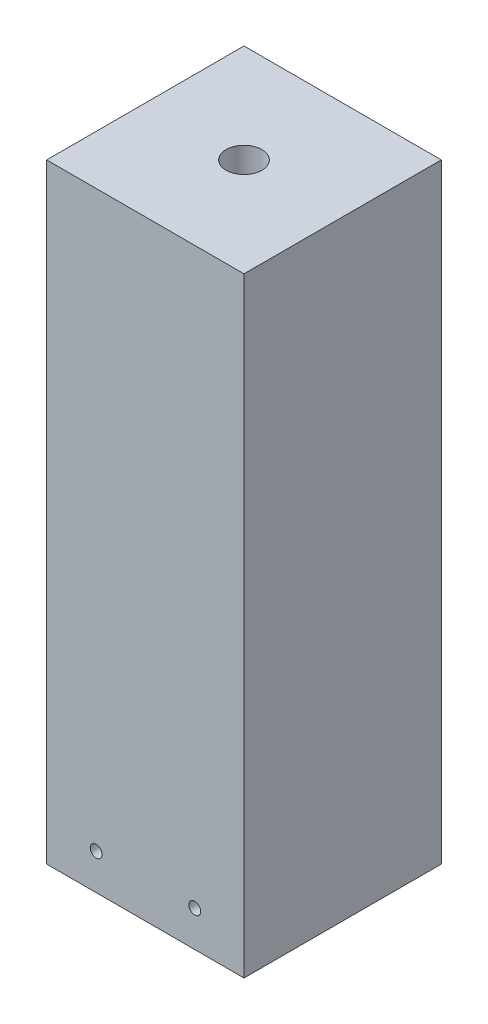
ISO-10303-21;
HEADER;
FILE_DESCRIPTION(('STEP AP214'),'2;1');
FILE_NAME('part.step','',(''),(''),'','','');
FILE_SCHEMA(('AUTOMOTIVE_DESIGN { 1 0 10303 214 1 1 1 1 }'));
ENDSEC;
DATA;
#1=APPLICATION_CONTEXT('core data for automotive mechanical design processes');
#2=APPLICATION_PROTOCOL_DEFINITION('international standard','automotive_design',2000,#1);
#3=PRODUCT_CONTEXT('',#1,'mechanical');
#4=PRODUCT('Part','Part','',(#3));
#5=PRODUCT_RELATED_PRODUCT_CATEGORY('part','',(#4));
#6=PRODUCT_DEFINITION_FORMATION('','',#4);
#7=PRODUCT_DEFINITION_CONTEXT('part definition',#1,'design');
#8=PRODUCT_DEFINITION('design','',#6,#7);
#9=PRODUCT_DEFINITION_SHAPE('','',#8);
#10=(LENGTH_UNIT() NAMED_UNIT(*) SI_UNIT(.MILLI.,.METRE.));
#11=(NAMED_UNIT(*) PLANE_ANGLE_UNIT() SI_UNIT($,.RADIAN.));
#12=(NAMED_UNIT(*) SI_UNIT($,.STERADIAN.) SOLID_ANGLE_UNIT());
#13=UNCERTAINTY_MEASURE_WITH_UNIT(LENGTH_MEASURE(1.E-05),#10,'distance_accuracy_value','');
#14=(GEOMETRIC_REPRESENTATION_CONTEXT(3) GLOBAL_UNCERTAINTY_ASSIGNED_CONTEXT((#13)) GLOBAL_UNIT_ASSIGNED_CONTEXT((#10,
#11,#12)) REPRESENTATION_CONTEXT('',''));
#15=CARTESIAN_POINT('',(0.,0.,0.));
#16=DIRECTION('',(0.,0.,1.));
#17=DIRECTION('',(1.,0.,0.));
#18=AXIS2_PLACEMENT_3D('',#15,#16,#17);
#19=CARTESIAN_POINT('',(0.,0.,0.));
#20=DIRECTION('',(0.,1.,0.));
#21=DIRECTION('',(0.,0.,1.));
#22=AXIS2_PLACEMENT_3D('',#19,#20,#21);
#23=PLANE('',#22);
#24=DIRECTION('',(0.,0.,-1.));
#25=VECTOR('',#24,1.);
#26=CARTESIAN_POINT('',(27.5,0.,-27.5));
#27=LINE('',#26,#25);
#28=CARTESIAN_POINT('',(27.5,0.,27.5));
#29=VERTEX_POINT('',#28);
#30=CARTESIAN_POINT('',(27.5,0.,-27.5));
#31=VERTEX_POINT('',#30);
#32=EDGE_CURVE('E219',#29,#31,#27,.T.);
#33=ORIENTED_EDGE('',*,*,#32,.F.);
#34=DIRECTION('',(1.,0.,0.));
#35=VECTOR('',#34,1.);
#36=CARTESIAN_POINT('',(-27.5,0.,27.5));
#37=LINE('',#36,#35);
#38=CARTESIAN_POINT('',(-27.5,0.,27.5));
#39=VERTEX_POINT('',#38);
#40=EDGE_CURVE('E225',#39,#29,#37,.T.);
#41=ORIENTED_EDGE('',*,*,#40,.F.);
#42=DIRECTION('',(0.,0.,1.));
#43=VECTOR('',#42,1.);
#44=CARTESIAN_POINT('',(-27.5,0.,-27.5));
#45=LINE('',#44,#43);
#46=CARTESIAN_POINT('',(-27.5,0.,-27.5));
#47=VERTEX_POINT('',#46);
#48=EDGE_CURVE('E241',#47,#39,#45,.T.);
#49=ORIENTED_EDGE('',*,*,#48,.F.);
#50=DIRECTION('',(-1.,0.,0.));
#51=VECTOR('',#50,1.);
#52=CARTESIAN_POINT('',(-27.5,0.,-27.5));
#53=LINE('',#52,#51);
#54=EDGE_CURVE('E238',#31,#47,#53,.T.);
#55=ORIENTED_EDGE('',*,*,#54,.F.);
#56=EDGE_LOOP('',(#33,#41,#49,#55));
#57=FACE_BOUND('',#56,.T.);
#58=DIRECTION('',(0.,0.,-1.));
#59=VECTOR('',#58,1.);
#60=CARTESIAN_POINT('',(23.,0.,-23.));
#61=LINE('',#60,#59);
#62=CARTESIAN_POINT('',(23.,0.,23.));
#63=VERTEX_POINT('',#62);
#64=CARTESIAN_POINT('',(23.,0.,-23.));
#65=VERTEX_POINT('',#64);
#66=EDGE_CURVE('E176',#63,#65,#61,.T.);
#67=ORIENTED_EDGE('',*,*,#66,.T.);
#68=DIRECTION('',(-1.,0.,0.));
#69=VECTOR('',#68,1.);
#70=CARTESIAN_POINT('',(-23.,0.,-23.));
#71=LINE('',#70,#69);
#72=CARTESIAN_POINT('',(-23.,0.,-23.));
#73=VERTEX_POINT('',#72);
#74=EDGE_CURVE('E195',#65,#73,#71,.T.);
#75=ORIENTED_EDGE('',*,*,#74,.T.);
#76=DIRECTION('',(0.,0.,1.));
#77=VECTOR('',#76,1.);
#78=CARTESIAN_POINT('',(-23.,0.,-23.));
#79=LINE('',#78,#77);
#80=CARTESIAN_POINT('',(-23.,0.,23.));
#81=VERTEX_POINT('',#80);
#82=EDGE_CURVE('E199',#73,#81,#79,.T.);
#83=ORIENTED_EDGE('',*,*,#82,.T.);
#84=DIRECTION('',(1.,0.,0.));
#85=VECTOR('',#84,1.);
#86=CARTESIAN_POINT('',(-23.,0.,23.));
#87=LINE('',#86,#85);
#88=EDGE_CURVE('E182',#81,#63,#87,.T.);
#89=ORIENTED_EDGE('',*,*,#88,.T.);
#90=EDGE_LOOP('',(#67,#75,#83,#89));
#91=FACE_BOUND('',#90,.T.);
#92=ADVANCED_FACE('F38',(#57,#91),#23,.F.);
#93=CARTESIAN_POINT('',(27.5,170.,-27.5));
#94=DIRECTION('',(-1.,0.,0.));
#95=DIRECTION('',(0.,0.,1.));
#96=AXIS2_PLACEMENT_3D('',#93,#94,#95);
#97=PLANE('',#96);
#98=ORIENTED_EDGE('',*,*,#32,.T.);
#99=DIRECTION('',(0.,-1.,0.));
#100=VECTOR('',#99,1.);
#101=CARTESIAN_POINT('',(27.5,170.,-27.5));
#102=LINE('',#101,#100);
#103=CARTESIAN_POINT('',(27.5,170.,-27.5));
#104=VERTEX_POINT('',#103);
#105=EDGE_CURVE('E11',#104,#31,#102,.T.);
#106=ORIENTED_EDGE('',*,*,#105,.F.);
#107=DIRECTION('',(0.,0.,-1.));
#108=VECTOR('',#107,1.);
#109=CARTESIAN_POINT('',(27.5,170.,-27.5));
#110=LINE('',#109,#108);
#111=CARTESIAN_POINT('',(27.5,170.,27.5));
#112=VERTEX_POINT('',#111);
#113=EDGE_CURVE('E220',#112,#104,#110,.T.);
#114=ORIENTED_EDGE('',*,*,#113,.F.);
#115=DIRECTION('',(0.,-1.,0.));
#116=VECTOR('',#115,1.);
#117=CARTESIAN_POINT('',(27.5,170.,27.5));
#118=LINE('',#117,#116);
#119=EDGE_CURVE('E234',#112,#29,#118,.T.);
#120=ORIENTED_EDGE('',*,*,#119,.T.);
#121=EDGE_LOOP('',(#98,#106,#114,#120));
#122=FACE_BOUND('',#121,.T.);
#123=ADVANCED_FACE('F40',(#122),#97,.F.);
#124=CARTESIAN_POINT('',(-27.5,170.,-27.5));
#125=DIRECTION('',(0.,0.,1.));
#126=DIRECTION('',(1.,0.,0.));
#127=AXIS2_PLACEMENT_3D('',#124,#125,#126);
#128=PLANE('',#127);
#129=CARTESIAN_POINT('',(13.784,10.000000066,-27.5));
#130=DIRECTION('',(0.,0.,-1.));
#131=DIRECTION('',(-1.,0.,0.));
#132=AXIS2_PLACEMENT_3D('',#129,#130,#131);
#133=CIRCLE('',#132,1.675);
#134=CARTESIAN_POINT('',(12.109,10.000000066,-27.5));
#135=VERTEX_POINT('',#134);
#136=EDGE_CURVE('E280',#135,#135,#133,.T.);
#137=ORIENTED_EDGE('',*,*,#136,.F.);
#138=EDGE_LOOP('',(#137));
#139=FACE_BOUND('',#138,.T.);
#140=CARTESIAN_POINT('',(-13.716,10.000000066,-27.5));
#141=DIRECTION('',(0.,0.,-1.));
#142=DIRECTION('',(-1.,0.,0.));
#143=AXIS2_PLACEMENT_3D('',#140,#141,#142);
#144=CIRCLE('',#143,1.675);
#145=CARTESIAN_POINT('',(-15.391,10.000000066,-27.5));
#146=VERTEX_POINT('',#145);
#147=EDGE_CURVE('E271',#146,#146,#144,.T.);
#148=ORIENTED_EDGE('',*,*,#147,.F.);
#149=EDGE_LOOP('',(#148));
#150=FACE_BOUND('',#149,.T.);
#151=ORIENTED_EDGE('',*,*,#54,.T.);
#152=DIRECTION('',(0.,-1.,0.));
#153=VECTOR('',#152,1.);
#154=CARTESIAN_POINT('',(-27.5,170.,-27.5));
#155=LINE('',#154,#153);
#156=CARTESIAN_POINT('',(-27.5,170.,-27.5));
#157=VERTEX_POINT('',#156);
#158=EDGE_CURVE('E48',#157,#47,#155,.T.);
#159=ORIENTED_EDGE('',*,*,#158,.F.);
#160=DIRECTION('',(-1.,0.,0.));
#161=VECTOR('',#160,1.);
#162=CARTESIAN_POINT('',(-27.5,170.,-27.5));
#163=LINE('',#162,#161);
#164=EDGE_CURVE('E224',#104,#157,#163,.T.);
#165=ORIENTED_EDGE('',*,*,#164,.F.);
#166=ORIENTED_EDGE('',*,*,#105,.T.);
#167=EDGE_LOOP('',(#151,#159,#165,#166));
#168=FACE_BOUND('',#167,.T.);
#169=ADVANCED_FACE('F307',(#139,#150,#168),#128,.F.);
#170=CARTESIAN_POINT('',(-27.5,170.,-27.5));
#171=DIRECTION('',(1.,0.,0.));
#172=DIRECTION('',(0.,0.,-1.));
#173=AXIS2_PLACEMENT_3D('',#170,#171,#172);
#174=PLANE('',#173);
#175=DIRECTION('',(0.,0.,1.));
#176=VECTOR('',#175,1.);
#177=CARTESIAN_POINT('',(-27.5,143.175390269917,7.50000000000001));
#178=LINE('',#177,#176);
#179=CARTESIAN_POINT('',(-27.5,143.175390269917,-7.499999972));
#180=VERTEX_POINT('',#179);
#181=CARTESIAN_POINT('',(-27.5,143.175390269917,7.50000000000001));
#182=VERTEX_POINT('',#181);
#183=EDGE_CURVE('E158',#180,#182,#178,.T.);
#184=ORIENTED_EDGE('',*,*,#183,.F.);
#185=DIRECTION('',(0.,-1.,0.));
#186=VECTOR('',#185,1.);
#187=CARTESIAN_POINT('',(-27.5,148.175390269917,-7.499999972));
#188=LINE('',#187,#186);
#189=CARTESIAN_POINT('',(-27.5,148.175390269917,-7.499999972));
#190=VERTEX_POINT('',#189);
#191=EDGE_CURVE('E148',#190,#180,#188,.T.);
#192=ORIENTED_EDGE('',*,*,#191,.F.);
#193=DIRECTION('',(0.,0.,-1.));
#194=VECTOR('',#193,1.);
#195=CARTESIAN_POINT('',(-27.5,148.175390269917,-7.499999972));
#196=LINE('',#195,#194);
#197=CARTESIAN_POINT('',(-27.5,148.175390269917,7.5));
#198=VERTEX_POINT('',#197);
#199=EDGE_CURVE('E162',#198,#190,#196,.T.);
#200=ORIENTED_EDGE('',*,*,#199,.F.);
#201=DIRECTION('',(0.,1.,0.));
#202=VECTOR('',#201,1.);
#203=CARTESIAN_POINT('',(-27.5,148.175390269917,7.5));
#204=LINE('',#203,#202);
#205=EDGE_CURVE('E56',#182,#198,#204,.T.);
#206=ORIENTED_EDGE('',*,*,#205,.F.);
#207=EDGE_LOOP('',(#184,#192,#200,#206));
#208=FACE_BOUND('',#207,.T.);
#209=ORIENTED_EDGE('',*,*,#48,.T.);
#210=DIRECTION('',(0.,-1.,0.));
#211=VECTOR('',#210,1.);
#212=CARTESIAN_POINT('',(-27.5,170.,27.5));
#213=LINE('',#212,#211);
#214=CARTESIAN_POINT('',(-27.5,170.,27.5));
#215=VERTEX_POINT('',#214);
#216=EDGE_CURVE('E249',#215,#39,#213,.T.);
#217=ORIENTED_EDGE('',*,*,#216,.F.);
#218=DIRECTION('',(0.,0.,1.));
#219=VECTOR('',#218,1.);
#220=CARTESIAN_POINT('',(-27.5,170.,-27.5));
#221=LINE('',#220,#219);
#222=EDGE_CURVE('E228',#157,#215,#221,.T.);
#223=ORIENTED_EDGE('',*,*,#222,.F.);
#224=ORIENTED_EDGE('',*,*,#158,.T.);
#225=EDGE_LOOP('',(#209,#217,#223,#224));
#226=FACE_BOUND('',#225,.T.);
#227=ADVANCED_FACE('F303',(#208,#226),#174,.F.);
#228=CARTESIAN_POINT('',(-27.5,170.,27.5));
#229=DIRECTION('',(0.,0.,-1.));
#230=DIRECTION('',(-1.,0.,0.));
#231=AXIS2_PLACEMENT_3D('',#228,#229,#230);
#232=PLANE('',#231);
#233=CARTESIAN_POINT('',(13.784,10.000000066,27.5));
#234=DIRECTION('',(0.,0.,-1.));
#235=DIRECTION('',(-1.,0.,0.));
#236=AXIS2_PLACEMENT_3D('',#233,#234,#235);
#237=CIRCLE('',#236,1.64999999999999);
#238=CARTESIAN_POINT('',(12.134,10.000000066,27.5));
#239=VERTEX_POINT('',#238);
#240=EDGE_CURVE('E265',#239,#239,#237,.T.);
#241=ORIENTED_EDGE('',*,*,#240,.T.);
#242=EDGE_LOOP('',(#241));
#243=FACE_BOUND('',#242,.T.);
#244=CARTESIAN_POINT('',(-13.716,10.000000066,27.5));
#245=DIRECTION('',(0.,0.,-1.));
#246=DIRECTION('',(-1.,0.,0.));
#247=AXIS2_PLACEMENT_3D('',#244,#245,#246);
#248=CIRCLE('',#247,1.64999999999999);
#249=CARTESIAN_POINT('',(-15.366,10.000000066,27.5));
#250=VERTEX_POINT('',#249);
#251=EDGE_CURVE('E260',#250,#250,#248,.T.);
#252=ORIENTED_EDGE('',*,*,#251,.T.);
#253=EDGE_LOOP('',(#252));
#254=FACE_BOUND('',#253,.T.);
#255=ORIENTED_EDGE('',*,*,#40,.T.);
#256=ORIENTED_EDGE('',*,*,#119,.F.);
#257=DIRECTION('',(1.,0.,0.));
#258=VECTOR('',#257,1.);
#259=CARTESIAN_POINT('',(-27.5,170.,27.5));
#260=LINE('',#259,#258);
#261=EDGE_CURVE('E231',#215,#112,#260,.T.);
#262=ORIENTED_EDGE('',*,*,#261,.F.);
#263=ORIENTED_EDGE('',*,*,#216,.T.);
#264=EDGE_LOOP('',(#255,#256,#262,#263));
#265=FACE_BOUND('',#264,.T.);
#266=ADVANCED_FACE('F306',(#243,#254,#265),#232,.F.);
#267=CARTESIAN_POINT('',(0.,170.,0.));
#268=DIRECTION('',(0.,1.,0.));
#269=DIRECTION('',(0.,0.,1.));
#270=AXIS2_PLACEMENT_3D('',#267,#268,#269);
#271=PLANE('',#270);
#272=CARTESIAN_POINT('',(0.,170.,0.));
#273=DIRECTION('',(0.,1.,0.));
#274=DIRECTION('',(0.,0.,1.));
#275=AXIS2_PLACEMENT_3D('',#272,#273,#274);
#276=CIRCLE('',#275,5.);
#277=CARTESIAN_POINT('',(0.,170.,5.));
#278=VERTEX_POINT('',#277);
#279=EDGE_CURVE('E494',#278,#278,#276,.T.);
#280=ORIENTED_EDGE('',*,*,#279,.F.);
#281=EDGE_LOOP('',(#280));
#282=FACE_BOUND('',#281,.T.);
#283=ORIENTED_EDGE('',*,*,#113,.T.);
#284=ORIENTED_EDGE('',*,*,#164,.T.);
#285=ORIENTED_EDGE('',*,*,#222,.T.);
#286=ORIENTED_EDGE('',*,*,#261,.T.);
#287=EDGE_LOOP('',(#283,#284,#285,#286));
#288=FACE_BOUND('',#287,.T.);
#289=ADVANCED_FACE('F324',(#282,#288),#271,.T.);
#290=CARTESIAN_POINT('',(23.,160.,-23.));
#291=DIRECTION('',(-1.,0.,0.));
#292=DIRECTION('',(0.,0.,1.));
#293=AXIS2_PLACEMENT_3D('',#290,#291,#292);
#294=PLANE('',#293);
#295=ORIENTED_EDGE('',*,*,#66,.F.);
#296=DIRECTION('',(0.,-1.,0.));
#297=VECTOR('',#296,1.);
#298=CARTESIAN_POINT('',(23.,160.,23.));
#299=LINE('',#298,#297);
#300=CARTESIAN_POINT('',(23.,160.,23.));
#301=VERTEX_POINT('',#300);
#302=EDGE_CURVE('E191',#301,#63,#299,.T.);
#303=ORIENTED_EDGE('',*,*,#302,.F.);
#304=DIRECTION('',(0.,0.,-1.));
#305=VECTOR('',#304,1.);
#306=CARTESIAN_POINT('',(23.,160.,-23.));
#307=LINE('',#306,#305);
#308=CARTESIAN_POINT('',(23.,160.,-23.));
#309=VERTEX_POINT('',#308);
#310=EDGE_CURVE('E177',#301,#309,#307,.T.);
#311=ORIENTED_EDGE('',*,*,#310,.T.);
#312=DIRECTION('',(0.,-1.,0.));
#313=VECTOR('',#312,1.);
#314=CARTESIAN_POINT('',(23.,160.,-23.));
#315=LINE('',#314,#313);
#316=EDGE_CURVE('E215',#309,#65,#315,.T.);
#317=ORIENTED_EDGE('',*,*,#316,.T.);
#318=EDGE_LOOP('',(#295,#303,#311,#317));
#319=FACE_BOUND('',#318,.T.);
#320=ADVANCED_FACE('F344',(#319),#294,.T.);
#321=CARTESIAN_POINT('',(-23.,160.,-23.));
#322=DIRECTION('',(0.,0.,1.));
#323=DIRECTION('',(1.,0.,0.));
#324=AXIS2_PLACEMENT_3D('',#321,#322,#323);
#325=PLANE('',#324);
#326=CARTESIAN_POINT('',(13.784,10.000000066,-23.));
#327=DIRECTION('',(0.,0.,1.));
#328=DIRECTION('',(1.,0.,0.));
#329=AXIS2_PLACEMENT_3D('',#326,#327,#328);
#330=CIRCLE('',#329,1.64999999999999);
#331=CARTESIAN_POINT('',(15.434,10.000000066,-23.));
#332=VERTEX_POINT('',#331);
#333=EDGE_CURVE('E264',#332,#332,#330,.T.);
#334=ORIENTED_EDGE('',*,*,#333,.F.);
#335=EDGE_LOOP('',(#334));
#336=FACE_BOUND('',#335,.T.);
#337=CARTESIAN_POINT('',(-13.716,10.000000066,-23.));
#338=DIRECTION('',(0.,0.,1.));
#339=DIRECTION('',(1.,0.,0.));
#340=AXIS2_PLACEMENT_3D('',#337,#338,#339);
#341=CIRCLE('',#340,1.64999999999999);
#342=CARTESIAN_POINT('',(-12.066,10.000000066,-23.));
#343=VERTEX_POINT('',#342);
#344=EDGE_CURVE('E256',#343,#343,#341,.T.);
#345=ORIENTED_EDGE('',*,*,#344,.F.);
#346=EDGE_LOOP('',(#345));
#347=FACE_BOUND('',#346,.T.);
#348=ORIENTED_EDGE('',*,*,#74,.F.);
#349=ORIENTED_EDGE('',*,*,#316,.F.);
#350=DIRECTION('',(-1.,0.,0.));
#351=VECTOR('',#350,1.);
#352=CARTESIAN_POINT('',(-23.,160.,-23.));
#353=LINE('',#352,#351);
#354=CARTESIAN_POINT('',(-23.,160.,-23.));
#355=VERTEX_POINT('',#354);
#356=EDGE_CURVE('E181',#309,#355,#353,.T.);
#357=ORIENTED_EDGE('',*,*,#356,.T.);
#358=DIRECTION('',(0.,-1.,0.));
#359=VECTOR('',#358,1.);
#360=CARTESIAN_POINT('',(-23.,160.,-23.));
#361=LINE('',#360,#359);
#362=EDGE_CURVE('E212',#355,#73,#361,.T.);
#363=ORIENTED_EDGE('',*,*,#362,.T.);
#364=EDGE_LOOP('',(#348,#349,#357,#363));
#365=FACE_BOUND('',#364,.T.);
#366=ADVANCED_FACE('F377',(#336,#347,#365),#325,.T.);
#367=CARTESIAN_POINT('',(-23.,160.,-23.));
#368=DIRECTION('',(1.,0.,0.));
#369=DIRECTION('',(0.,0.,-1.));
#370=AXIS2_PLACEMENT_3D('',#367,#368,#369);
#371=PLANE('',#370);
#372=DIRECTION('',(0.,-1.,0.));
#373=VECTOR('',#372,1.);
#374=CARTESIAN_POINT('',(-23.,148.175390269917,-7.499999972));
#375=LINE('',#374,#373);
#376=CARTESIAN_POINT('',(-23.,148.175390269917,-7.499999972));
#377=VERTEX_POINT('',#376);
#378=CARTESIAN_POINT('',(-23.,143.175390269917,-7.499999972));
#379=VERTEX_POINT('',#378);
#380=EDGE_CURVE('E145',#377,#379,#375,.T.);
#381=ORIENTED_EDGE('',*,*,#380,.T.);
#382=DIRECTION('',(0.,0.,1.));
#383=VECTOR('',#382,1.);
#384=CARTESIAN_POINT('',(-23.,143.175390269917,7.50000000000001));
#385=LINE('',#384,#383);
#386=CARTESIAN_POINT('',(-23.,143.175390269917,7.50000000000001));
#387=VERTEX_POINT('',#386);
#388=EDGE_CURVE('E131',#379,#387,#385,.T.);
#389=ORIENTED_EDGE('',*,*,#388,.T.);
#390=DIRECTION('',(0.,1.,0.));
#391=VECTOR('',#390,1.);
#392=CARTESIAN_POINT('',(-23.,148.175390269917,7.5));
#393=LINE('',#392,#391);
#394=CARTESIAN_POINT('',(-23.,148.175390269917,7.5));
#395=VERTEX_POINT('',#394);
#396=EDGE_CURVE('E167',#387,#395,#393,.T.);
#397=ORIENTED_EDGE('',*,*,#396,.T.);
#398=DIRECTION('',(0.,0.,-1.));
#399=VECTOR('',#398,1.);
#400=CARTESIAN_POINT('',(-23.,148.175390269917,-7.499999972));
#401=LINE('',#400,#399);
#402=EDGE_CURVE('E154',#395,#377,#401,.T.);
#403=ORIENTED_EDGE('',*,*,#402,.T.);
#404=EDGE_LOOP('',(#381,#389,#397,#403));
#405=FACE_BOUND('',#404,.T.);
#406=ORIENTED_EDGE('',*,*,#82,.F.);
#407=ORIENTED_EDGE('',*,*,#362,.F.);
#408=DIRECTION('',(0.,0.,1.));
#409=VECTOR('',#408,1.);
#410=CARTESIAN_POINT('',(-23.,160.,-23.));
#411=LINE('',#410,#409);
#412=CARTESIAN_POINT('',(-23.,160.,23.));
#413=VERTEX_POINT('',#412);
#414=EDGE_CURVE('E185',#355,#413,#411,.T.);
#415=ORIENTED_EDGE('',*,*,#414,.T.);
#416=DIRECTION('',(0.,-1.,0.));
#417=VECTOR('',#416,1.);
#418=CARTESIAN_POINT('',(-23.,160.,23.));
#419=LINE('',#418,#417);
#420=EDGE_CURVE('E209',#413,#81,#419,.T.);
#421=ORIENTED_EDGE('',*,*,#420,.T.);
#422=EDGE_LOOP('',(#406,#407,#415,#421));
#423=FACE_BOUND('',#422,.T.);
#424=ADVANCED_FACE('F152',(#405,#423),#371,.T.);
#425=CARTESIAN_POINT('',(-23.,160.,23.));
#426=DIRECTION('',(0.,0.,-1.));
#427=DIRECTION('',(-1.,0.,0.));
#428=AXIS2_PLACEMENT_3D('',#425,#426,#427);
#429=PLANE('',#428);
#430=CARTESIAN_POINT('',(13.784,10.000000066,23.));
#431=DIRECTION('',(0.,0.,-1.));
#432=DIRECTION('',(-1.,0.,0.));
#433=AXIS2_PLACEMENT_3D('',#430,#431,#432);
#434=CIRCLE('',#433,1.64999999999999);
#435=CARTESIAN_POINT('',(12.134,10.000000066,23.));
#436=VERTEX_POINT('',#435);
#437=EDGE_CURVE('E261',#436,#436,#434,.T.);
#438=ORIENTED_EDGE('',*,*,#437,.F.);
#439=EDGE_LOOP('',(#438));
#440=FACE_BOUND('',#439,.T.);
#441=CARTESIAN_POINT('',(-13.716,10.000000066,23.));
#442=DIRECTION('',(0.,0.,-1.));
#443=DIRECTION('',(-1.,0.,0.));
#444=AXIS2_PLACEMENT_3D('',#441,#442,#443);
#445=CIRCLE('',#444,1.64999999999999);
#446=CARTESIAN_POINT('',(-15.366,10.000000066,23.));
#447=VERTEX_POINT('',#446);
#448=EDGE_CURVE('E259',#447,#447,#445,.T.);
#449=ORIENTED_EDGE('',*,*,#448,.F.);
#450=EDGE_LOOP('',(#449));
#451=FACE_BOUND('',#450,.T.);
#452=ORIENTED_EDGE('',*,*,#88,.F.);
#453=ORIENTED_EDGE('',*,*,#420,.F.);
#454=DIRECTION('',(1.,0.,0.));
#455=VECTOR('',#454,1.);
#456=CARTESIAN_POINT('',(-23.,160.,23.));
#457=LINE('',#456,#455);
#458=EDGE_CURVE('E188',#413,#301,#457,.T.);
#459=ORIENTED_EDGE('',*,*,#458,.T.);
#460=ORIENTED_EDGE('',*,*,#302,.T.);
#461=EDGE_LOOP('',(#452,#453,#459,#460));
#462=FACE_BOUND('',#461,.T.);
#463=ADVANCED_FACE('F391',(#440,#451,#462),#429,.T.);
#464=CARTESIAN_POINT('',(0.,160.,0.));
#465=DIRECTION('',(0.,1.,0.));
#466=DIRECTION('',(0.,0.,1.));
#467=AXIS2_PLACEMENT_3D('',#464,#465,#466);
#468=PLANE('',#467);
#469=CARTESIAN_POINT('',(0.,160.,0.));
#470=DIRECTION('',(0.,1.,0.));
#471=DIRECTION('',(0.,0.,1.));
#472=AXIS2_PLACEMENT_3D('',#469,#470,#471);
#473=CIRCLE('',#472,5.);
#474=CARTESIAN_POINT('',(0.,160.,5.));
#475=VERTEX_POINT('',#474);
#476=EDGE_CURVE('E42',#475,#475,#473,.T.);
#477=ORIENTED_EDGE('',*,*,#476,.T.);
#478=EDGE_LOOP('',(#477));
#479=FACE_BOUND('',#478,.T.);
#480=ORIENTED_EDGE('',*,*,#310,.F.);
#481=ORIENTED_EDGE('',*,*,#458,.F.);
#482=ORIENTED_EDGE('',*,*,#414,.F.);
#483=ORIENTED_EDGE('',*,*,#356,.F.);
#484=EDGE_LOOP('',(#480,#481,#482,#483));
#485=FACE_BOUND('',#484,.T.);
#486=ADVANCED_FACE('F394',(#479,#485),#468,.F.);
#487=CARTESIAN_POINT('',(-7.18861172572124,148.175390269917,-7.499999972));
#488=DIRECTION('',(0.,0.,-1.));
#489=DIRECTION('',(-1.,0.,0.));
#490=AXIS2_PLACEMENT_3D('',#487,#488,#489);
#491=PLANE('',#490);
#492=DIRECTION('',(-1.,0.,0.));
#493=VECTOR('',#492,1.);
#494=CARTESIAN_POINT('',(-7.18861172572124,148.175390269917,-7.499999972));
#495=LINE('',#494,#493);
#496=EDGE_CURVE('E64',#377,#190,#495,.T.);
#497=ORIENTED_EDGE('',*,*,#496,.T.);
#498=ORIENTED_EDGE('',*,*,#191,.T.);
#499=DIRECTION('',(-1.,0.,0.));
#500=VECTOR('',#499,1.);
#501=CARTESIAN_POINT('',(-7.18861172572124,143.175390269917,-7.499999972));
#502=LINE('',#501,#500);
#503=EDGE_CURVE('E135',#379,#180,#502,.T.);
#504=ORIENTED_EDGE('',*,*,#503,.F.);
#505=ORIENTED_EDGE('',*,*,#380,.F.);
#506=EDGE_LOOP('',(#497,#498,#504,#505));
#507=FACE_BOUND('',#506,.T.);
#508=ADVANCED_FACE('F144',(#507),#491,.F.);
#509=CARTESIAN_POINT('',(-7.18861172572124,143.175390269917,7.5));
#510=DIRECTION('',(0.,-1.,0.));
#511=DIRECTION('',(0.,0.,-1.));
#512=AXIS2_PLACEMENT_3D('',#509,#510,#511);
#513=PLANE('',#512);
#514=ORIENTED_EDGE('',*,*,#503,.T.);
#515=ORIENTED_EDGE('',*,*,#183,.T.);
#516=DIRECTION('',(-1.,0.,0.));
#517=VECTOR('',#516,1.);
#518=CARTESIAN_POINT('',(-7.18861172572124,143.175390269917,7.5));
#519=LINE('',#518,#517);
#520=EDGE_CURVE('E137',#387,#182,#519,.T.);
#521=ORIENTED_EDGE('',*,*,#520,.F.);
#522=ORIENTED_EDGE('',*,*,#388,.F.);
#523=EDGE_LOOP('',(#514,#515,#521,#522));
#524=FACE_BOUND('',#523,.T.);
#525=ADVANCED_FACE('F133',(#524),#513,.F.);
#526=CARTESIAN_POINT('',(-7.18861172572124,148.175390269917,7.5));
#527=DIRECTION('',(0.,0.,1.));
#528=DIRECTION('',(0.,-1.,0.));
#529=AXIS2_PLACEMENT_3D('',#526,#527,#528);
#530=PLANE('',#529);
#531=ORIENTED_EDGE('',*,*,#520,.T.);
#532=ORIENTED_EDGE('',*,*,#205,.T.);
#533=DIRECTION('',(-1.,0.,0.));
#534=VECTOR('',#533,1.);
#535=CARTESIAN_POINT('',(-7.18861172572124,148.175390269917,7.5));
#536=LINE('',#535,#534);
#537=EDGE_CURVE('E166',#395,#198,#536,.T.);
#538=ORIENTED_EDGE('',*,*,#537,.F.);
#539=ORIENTED_EDGE('',*,*,#396,.F.);
#540=EDGE_LOOP('',(#531,#532,#538,#539));
#541=FACE_BOUND('',#540,.T.);
#542=ADVANCED_FACE('F370',(#541),#530,.F.);
#543=CARTESIAN_POINT('',(-7.18861172572124,148.175390269917,-7.499999972));
#544=DIRECTION('',(0.,1.,0.));
#545=DIRECTION('',(0.,0.,1.));
#546=AXIS2_PLACEMENT_3D('',#543,#544,#545);
#547=PLANE('',#546);
#548=ORIENTED_EDGE('',*,*,#537,.T.);
#549=ORIENTED_EDGE('',*,*,#199,.T.);
#550=ORIENTED_EDGE('',*,*,#496,.F.);
#551=ORIENTED_EDGE('',*,*,#402,.F.);
#552=EDGE_LOOP('',(#548,#549,#550,#551));
#553=FACE_BOUND('',#552,.T.);
#554=ADVANCED_FACE('F301',(#553),#547,.F.);
#555=CARTESIAN_POINT('',(-13.716,10.000000066,-27.5));
#556=DIRECTION('',(0.,0.,-1.));
#557=DIRECTION('',(-1.,0.,0.));
#558=AXIS2_PLACEMENT_3D('',#555,#556,#557);
#559=CYLINDRICAL_SURFACE('',#558,1.64999999999999);
#560=ORIENTED_EDGE('',*,*,#344,.T.);
#561=EDGE_LOOP('',(#560));
#562=FACE_BOUND('',#561,.T.);
#563=CARTESIAN_POINT('',(-13.716,10.000000066,-27.475));
#564=DIRECTION('',(0.,0.,-1.));
#565=DIRECTION('',(-1.,0.,0.));
#566=AXIS2_PLACEMENT_3D('',#563,#564,#565);
#567=CIRCLE('',#566,1.65);
#568=CARTESIAN_POINT('',(-15.366,10.000000066,-27.475));
#569=VERTEX_POINT('',#568);
#570=EDGE_CURVE('E287',#569,#569,#567,.T.);
#571=ORIENTED_EDGE('',*,*,#570,.T.);
#572=EDGE_LOOP('',(#571));
#573=FACE_BOUND('',#572,.T.);
#574=ADVANCED_FACE('F355',(#562,#573),#559,.F.);
#575=CARTESIAN_POINT('',(-13.716,10.000000066,-27.5));
#576=DIRECTION('',(0.,0.,-1.));
#577=DIRECTION('',(-1.,0.,0.));
#578=AXIS2_PLACEMENT_3D('',#575,#576,#577);
#579=CONICAL_SURFACE('',#578,1.675,0.785398163397414);
#580=ORIENTED_EDGE('',*,*,#570,.F.);
#581=EDGE_LOOP('',(#580));
#582=FACE_BOUND('',#581,.T.);
#583=ORIENTED_EDGE('',*,*,#147,.T.);
#584=EDGE_LOOP('',(#583));
#585=FACE_BOUND('',#584,.T.);
#586=ADVANCED_FACE('F352',(#582,#585),#579,.F.);
#587=ORIENTED_EDGE('',*,*,#448,.T.);
#588=EDGE_LOOP('',(#587));
#589=FACE_BOUND('',#588,.T.);
#590=ORIENTED_EDGE('',*,*,#251,.F.);
#591=EDGE_LOOP('',(#590));
#592=FACE_BOUND('',#591,.T.);
#593=ADVANCED_FACE('F349',(#589,#592),#559,.F.);
#594=CARTESIAN_POINT('',(13.784,10.000000066,-27.5));
#595=DIRECTION('',(0.,0.,-1.));
#596=DIRECTION('',(-1.,0.,0.));
#597=AXIS2_PLACEMENT_3D('',#594,#595,#596);
#598=CYLINDRICAL_SURFACE('',#597,1.64999999999999);
#599=ORIENTED_EDGE('',*,*,#437,.T.);
#600=EDGE_LOOP('',(#599));
#601=FACE_BOUND('',#600,.T.);
#602=ORIENTED_EDGE('',*,*,#240,.F.);
#603=EDGE_LOOP('',(#602));
#604=FACE_BOUND('',#603,.T.);
#605=ADVANCED_FACE('F351',(#601,#604),#598,.F.);
#606=ORIENTED_EDGE('',*,*,#333,.T.);
#607=EDGE_LOOP('',(#606));
#608=FACE_BOUND('',#607,.T.);
#609=CARTESIAN_POINT('',(13.784,10.000000066,-27.475));
#610=DIRECTION('',(0.,0.,-1.));
#611=DIRECTION('',(-1.,0.,0.));
#612=AXIS2_PLACEMENT_3D('',#609,#610,#611);
#613=CIRCLE('',#612,1.65);
#614=CARTESIAN_POINT('',(12.134,10.000000066,-27.475));
#615=VERTEX_POINT('',#614);
#616=EDGE_CURVE('E274',#615,#615,#613,.T.);
#617=ORIENTED_EDGE('',*,*,#616,.T.);
#618=EDGE_LOOP('',(#617));
#619=FACE_BOUND('',#618,.T.);
#620=ADVANCED_FACE('F360',(#608,#619),#598,.F.);
#621=CARTESIAN_POINT('',(13.784,10.000000066,-27.5));
#622=DIRECTION('',(0.,0.,-1.));
#623=DIRECTION('',(-1.,0.,0.));
#624=AXIS2_PLACEMENT_3D('',#621,#622,#623);
#625=CONICAL_SURFACE('',#624,1.675,0.785398163397414);
#626=ORIENTED_EDGE('',*,*,#616,.F.);
#627=EDGE_LOOP('',(#626));
#628=FACE_BOUND('',#627,.T.);
#629=ORIENTED_EDGE('',*,*,#136,.T.);
#630=EDGE_LOOP('',(#629));
#631=FACE_BOUND('',#630,.T.);
#632=ADVANCED_FACE('F455',(#628,#631),#625,.F.);
#633=CARTESIAN_POINT('',(0.,0.,0.));
#634=DIRECTION('',(0.,1.,0.));
#635=DIRECTION('',(0.,0.,1.));
#636=AXIS2_PLACEMENT_3D('',#633,#634,#635);
#637=CYLINDRICAL_SURFACE('',#636,5.);
#638=ORIENTED_EDGE('',*,*,#279,.T.);
#639=EDGE_LOOP('',(#638));
#640=FACE_BOUND('',#639,.T.);
#641=ORIENTED_EDGE('',*,*,#476,.F.);
#642=EDGE_LOOP('',(#641));
#643=FACE_BOUND('',#642,.T.);
#644=ADVANCED_FACE('F463',(#640,#643),#637,.F.);
#645=CLOSED_SHELL('',(#92,#123,#169,#227,#266,#289,#320,#366,#424,#463,#486,#508,#525,#542,#554,
#574,#586,#593,#605,#620,#632,#644));
#646=MANIFOLD_SOLID_BREP('B2',#645);
#647=ADVANCED_BREP_SHAPE_REPRESENTATION('',(#18,#646),#14);
#648=SHAPE_DEFINITION_REPRESENTATION(#9,#647);
ENDSEC;
END-ISO-10303-21;
